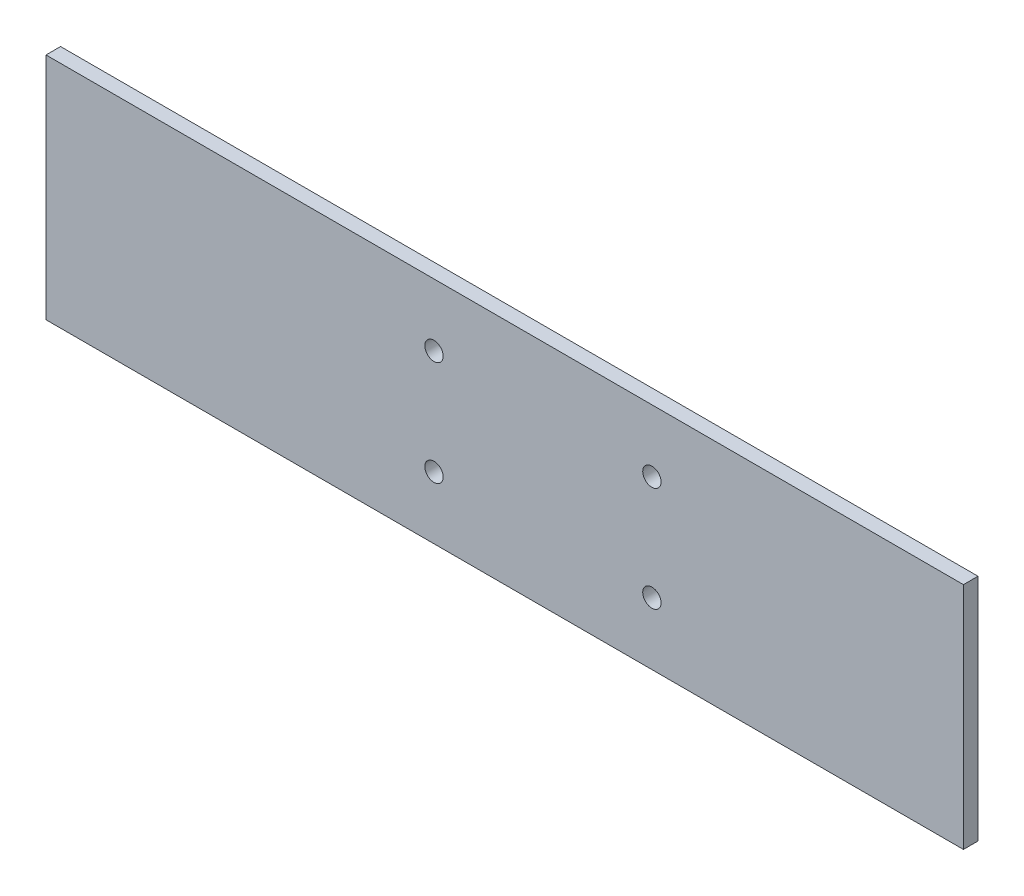
ISO-10303-21;
HEADER;
FILE_DESCRIPTION(('STEP AP214'),'2;1');
FILE_NAME('part.step','',(''),(''),'','','');
FILE_SCHEMA(('AUTOMOTIVE_DESIGN { 1 0 10303 214 1 1 1 1 }'));
ENDSEC;
DATA;
#1=APPLICATION_CONTEXT('core data for automotive mechanical design processes');
#2=APPLICATION_PROTOCOL_DEFINITION('international standard','automotive_design',2000,#1);
#3=PRODUCT_CONTEXT('',#1,'mechanical');
#4=PRODUCT('Part','Part','',(#3));
#5=PRODUCT_RELATED_PRODUCT_CATEGORY('part','',(#4));
#6=PRODUCT_DEFINITION_FORMATION('','',#4);
#7=PRODUCT_DEFINITION_CONTEXT('part definition',#1,'design');
#8=PRODUCT_DEFINITION('design','',#6,#7);
#9=PRODUCT_DEFINITION_SHAPE('','',#8);
#10=(LENGTH_UNIT() NAMED_UNIT(*) SI_UNIT(.MILLI.,.METRE.));
#11=(NAMED_UNIT(*) PLANE_ANGLE_UNIT() SI_UNIT($,.RADIAN.));
#12=(NAMED_UNIT(*) SI_UNIT($,.STERADIAN.) SOLID_ANGLE_UNIT());
#13=UNCERTAINTY_MEASURE_WITH_UNIT(LENGTH_MEASURE(1.E-05),#10,'distance_accuracy_value','');
#14=(GEOMETRIC_REPRESENTATION_CONTEXT(3) GLOBAL_UNCERTAINTY_ASSIGNED_CONTEXT((#13)) GLOBAL_UNIT_ASSIGNED_CONTEXT((#10,
#11,#12)) REPRESENTATION_CONTEXT('',''));
#15=CARTESIAN_POINT('',(0.,0.,0.));
#16=DIRECTION('',(0.,0.,1.));
#17=DIRECTION('',(1.,0.,0.));
#18=AXIS2_PLACEMENT_3D('',#15,#16,#17);
#19=CARTESIAN_POINT('',(0.,0.,9.525));
#20=DIRECTION('',(0.,0.,1.));
#21=DIRECTION('',(1.,0.,0.));
#22=AXIS2_PLACEMENT_3D('',#19,#20,#21);
#23=PLANE('',#22);
#24=CARTESIAN_POINT('',(196.25,-109.25,9.525));
#25=DIRECTION('',(0.,0.,1.));
#26=DIRECTION('',(1.,0.,0.));
#27=AXIS2_PLACEMENT_3D('',#24,#25,#26);
#28=CIRCLE('',#27,6.00000000000002);
#29=CARTESIAN_POINT('',(190.25,-109.25,9.525));
#30=VERTEX_POINT('',#29);
#31=EDGE_CURVE('E111',#30,#30,#28,.T.);
#32=ORIENTED_EDGE('',*,*,#31,.F.);
#33=EDGE_LOOP('',(#32));
#34=FACE_BOUND('',#33,.T.);
#35=CARTESIAN_POINT('',(53.75,-40.75,9.525));
#36=DIRECTION('',(0.,0.,1.));
#37=DIRECTION('',(1.,0.,0.));
#38=AXIS2_PLACEMENT_3D('',#35,#36,#37);
#39=CIRCLE('',#38,6.00000000000001);
#40=CARTESIAN_POINT('',(47.75,-40.75,9.525));
#41=VERTEX_POINT('',#40);
#42=EDGE_CURVE('E123',#41,#41,#39,.T.);
#43=ORIENTED_EDGE('',*,*,#42,.F.);
#44=EDGE_LOOP('',(#43));
#45=FACE_BOUND('',#44,.T.);
#46=DIRECTION('',(-1.,0.,0.));
#47=VECTOR('',#46,1.);
#48=CARTESIAN_POINT('',(0.,0.,9.525));
#49=LINE('',#48,#47);
#50=CARTESIAN_POINT('',(400.,0.,9.525));
#51=VERTEX_POINT('',#50);
#52=CARTESIAN_POINT('',(-200.,0.,9.525));
#53=VERTEX_POINT('',#52);
#54=EDGE_CURVE('E11',#51,#53,#49,.T.);
#55=ORIENTED_EDGE('',*,*,#54,.T.);
#56=DIRECTION('',(0.,1.,0.));
#57=VECTOR('',#56,1.);
#58=CARTESIAN_POINT('',(-200.,0.,9.525));
#59=LINE('',#58,#57);
#60=CARTESIAN_POINT('',(-200.,-150.,9.525));
#61=VERTEX_POINT('',#60);
#62=EDGE_CURVE('E76',#61,#53,#59,.T.);
#63=ORIENTED_EDGE('',*,*,#62,.F.);
#64=DIRECTION('',(1.,0.,0.));
#65=VECTOR('',#64,1.);
#66=CARTESIAN_POINT('',(0.,-150.,9.525));
#67=LINE('',#66,#65);
#68=CARTESIAN_POINT('',(400.,-150.,9.525));
#69=VERTEX_POINT('',#68);
#70=EDGE_CURVE('E42',#61,#69,#67,.T.);
#71=ORIENTED_EDGE('',*,*,#70,.T.);
#72=DIRECTION('',(0.,-1.,0.));
#73=VECTOR('',#72,1.);
#74=CARTESIAN_POINT('',(400.,0.,9.525));
#75=LINE('',#74,#73);
#76=EDGE_CURVE('E75',#51,#69,#75,.T.);
#77=ORIENTED_EDGE('',*,*,#76,.F.);
#78=EDGE_LOOP('',(#55,#63,#71,#77));
#79=FACE_BOUND('',#78,.T.);
#80=CARTESIAN_POINT('',(196.25,-40.75,9.525));
#81=DIRECTION('',(0.,0.,1.));
#82=DIRECTION('',(1.,0.,0.));
#83=AXIS2_PLACEMENT_3D('',#80,#81,#82);
#84=CIRCLE('',#83,6.00000000000002);
#85=CARTESIAN_POINT('',(190.25,-40.75,9.525));
#86=VERTEX_POINT('',#85);
#87=EDGE_CURVE('E117',#86,#86,#84,.T.);
#88=ORIENTED_EDGE('',*,*,#87,.F.);
#89=EDGE_LOOP('',(#88));
#90=FACE_BOUND('',#89,.T.);
#91=CARTESIAN_POINT('',(53.75,-109.25,9.525));
#92=DIRECTION('',(0.,0.,1.));
#93=DIRECTION('',(1.,0.,0.));
#94=AXIS2_PLACEMENT_3D('',#91,#92,#93);
#95=CIRCLE('',#94,6.00000000000001);
#96=CARTESIAN_POINT('',(47.75,-109.25,9.525));
#97=VERTEX_POINT('',#96);
#98=EDGE_CURVE('E105',#97,#97,#95,.T.);
#99=ORIENTED_EDGE('',*,*,#98,.F.);
#100=EDGE_LOOP('',(#99));
#101=FACE_BOUND('',#100,.T.);
#102=ADVANCED_FACE('F33',(#34,#45,#79,#90,#101),#23,.T.);
#103=CARTESIAN_POINT('',(0.,0.,0.));
#104=DIRECTION('',(0.,0.,1.));
#105=DIRECTION('',(1.,0.,0.));
#106=AXIS2_PLACEMENT_3D('',#103,#104,#105);
#107=PLANE('',#106);
#108=DIRECTION('',(1.,0.,0.));
#109=VECTOR('',#108,1.);
#110=CARTESIAN_POINT('',(0.,-150.,0.));
#111=LINE('',#110,#109);
#112=CARTESIAN_POINT('',(-200.,-150.,0.));
#113=VERTEX_POINT('',#112);
#114=CARTESIAN_POINT('',(400.,-150.,0.));
#115=VERTEX_POINT('',#114);
#116=EDGE_CURVE('E83',#113,#115,#111,.T.);
#117=ORIENTED_EDGE('',*,*,#116,.F.);
#118=DIRECTION('',(0.,-1.,0.));
#119=VECTOR('',#118,1.);
#120=CARTESIAN_POINT('',(-200.,0.,0.));
#121=LINE('',#120,#119);
#122=CARTESIAN_POINT('',(-200.,0.,0.));
#123=VERTEX_POINT('',#122);
#124=EDGE_CURVE('E96',#123,#113,#121,.T.);
#125=ORIENTED_EDGE('',*,*,#124,.F.);
#126=DIRECTION('',(-1.,0.,0.));
#127=VECTOR('',#126,1.);
#128=CARTESIAN_POINT('',(0.,0.,0.));
#129=LINE('',#128,#127);
#130=CARTESIAN_POINT('',(400.,0.,0.));
#131=VERTEX_POINT('',#130);
#132=EDGE_CURVE('E37',#131,#123,#129,.T.);
#133=ORIENTED_EDGE('',*,*,#132,.F.);
#134=DIRECTION('',(0.,1.,0.));
#135=VECTOR('',#134,1.);
#136=CARTESIAN_POINT('',(400.,0.,0.));
#137=LINE('',#136,#135);
#138=EDGE_CURVE('E87',#115,#131,#137,.T.);
#139=ORIENTED_EDGE('',*,*,#138,.F.);
#140=EDGE_LOOP('',(#117,#125,#133,#139));
#141=FACE_BOUND('',#140,.T.);
#142=CARTESIAN_POINT('',(53.75,-40.75,0.));
#143=DIRECTION('',(0.,0.,1.));
#144=DIRECTION('',(1.,0.,0.));
#145=AXIS2_PLACEMENT_3D('',#142,#143,#144);
#146=CIRCLE('',#145,6.00000000000001);
#147=CARTESIAN_POINT('',(47.75,-40.75,0.));
#148=VERTEX_POINT('',#147);
#149=EDGE_CURVE('E120',#148,#148,#146,.T.);
#150=ORIENTED_EDGE('',*,*,#149,.T.);
#151=EDGE_LOOP('',(#150));
#152=FACE_BOUND('',#151,.T.);
#153=CARTESIAN_POINT('',(196.25,-40.75,0.));
#154=DIRECTION('',(0.,0.,1.));
#155=DIRECTION('',(1.,0.,0.));
#156=AXIS2_PLACEMENT_3D('',#153,#154,#155);
#157=CIRCLE('',#156,6.00000000000002);
#158=CARTESIAN_POINT('',(190.25,-40.75,0.));
#159=VERTEX_POINT('',#158);
#160=EDGE_CURVE('E114',#159,#159,#157,.T.);
#161=ORIENTED_EDGE('',*,*,#160,.T.);
#162=EDGE_LOOP('',(#161));
#163=FACE_BOUND('',#162,.T.);
#164=CARTESIAN_POINT('',(196.25,-109.25,0.));
#165=DIRECTION('',(0.,0.,1.));
#166=DIRECTION('',(1.,0.,0.));
#167=AXIS2_PLACEMENT_3D('',#164,#165,#166);
#168=CIRCLE('',#167,6.00000000000002);
#169=CARTESIAN_POINT('',(190.25,-109.25,0.));
#170=VERTEX_POINT('',#169);
#171=EDGE_CURVE('E108',#170,#170,#168,.T.);
#172=ORIENTED_EDGE('',*,*,#171,.T.);
#173=EDGE_LOOP('',(#172));
#174=FACE_BOUND('',#173,.T.);
#175=CARTESIAN_POINT('',(53.75,-109.25,0.));
#176=DIRECTION('',(0.,0.,1.));
#177=DIRECTION('',(1.,0.,0.));
#178=AXIS2_PLACEMENT_3D('',#175,#176,#177);
#179=CIRCLE('',#178,6.00000000000001);
#180=CARTESIAN_POINT('',(47.75,-109.25,0.));
#181=VERTEX_POINT('',#180);
#182=EDGE_CURVE('E104',#181,#181,#179,.T.);
#183=ORIENTED_EDGE('',*,*,#182,.T.);
#184=EDGE_LOOP('',(#183));
#185=FACE_BOUND('',#184,.T.);
#186=ADVANCED_FACE('F129',(#141,#152,#163,#174,#185),#107,.F.);
#187=CARTESIAN_POINT('',(0.,-150.,9.525));
#188=DIRECTION('',(0.,1.,0.));
#189=DIRECTION('',(0.,0.,1.));
#190=AXIS2_PLACEMENT_3D('',#187,#188,#189);
#191=PLANE('',#190);
#192=ORIENTED_EDGE('',*,*,#116,.T.);
#193=DIRECTION('',(0.,0.,-1.));
#194=VECTOR('',#193,1.);
#195=CARTESIAN_POINT('',(400.,-150.,9.525));
#196=LINE('',#195,#194);
#197=EDGE_CURVE('E82',#69,#115,#196,.T.);
#198=ORIENTED_EDGE('',*,*,#197,.F.);
#199=ORIENTED_EDGE('',*,*,#70,.F.);
#200=DIRECTION('',(0.,0.,1.));
#201=VECTOR('',#200,1.);
#202=CARTESIAN_POINT('',(-200.,-150.,0.));
#203=LINE('',#202,#201);
#204=EDGE_CURVE('E99',#113,#61,#203,.T.);
#205=ORIENTED_EDGE('',*,*,#204,.F.);
#206=EDGE_LOOP('',(#192,#198,#199,#205));
#207=FACE_BOUND('',#206,.T.);
#208=ADVANCED_FACE('F35',(#207),#191,.F.);
#209=CARTESIAN_POINT('',(0.,0.,9.525));
#210=DIRECTION('',(0.,-1.,0.));
#211=DIRECTION('',(0.,0.,-1.));
#212=AXIS2_PLACEMENT_3D('',#209,#210,#211);
#213=PLANE('',#212);
#214=ORIENTED_EDGE('',*,*,#132,.T.);
#215=DIRECTION('',(0.,0.,-1.));
#216=VECTOR('',#215,1.);
#217=CARTESIAN_POINT('',(-200.,0.,0.));
#218=LINE('',#217,#216);
#219=EDGE_CURVE('E102',#53,#123,#218,.T.);
#220=ORIENTED_EDGE('',*,*,#219,.F.);
#221=ORIENTED_EDGE('',*,*,#54,.F.);
#222=DIRECTION('',(0.,0.,1.));
#223=VECTOR('',#222,1.);
#224=CARTESIAN_POINT('',(400.,0.,9.525));
#225=LINE('',#224,#223);
#226=EDGE_CURVE('E91',#131,#51,#225,.T.);
#227=ORIENTED_EDGE('',*,*,#226,.F.);
#228=EDGE_LOOP('',(#214,#220,#221,#227));
#229=FACE_BOUND('',#228,.T.);
#230=ADVANCED_FACE('F135',(#229),#213,.F.);
#231=CARTESIAN_POINT('',(53.75,-40.75,9.525));
#232=DIRECTION('',(0.,0.,-1.));
#233=DIRECTION('',(-1.,0.,0.));
#234=AXIS2_PLACEMENT_3D('',#231,#232,#233);
#235=CYLINDRICAL_SURFACE('',#234,6.00000000000001);
#236=CARTESIAN_POINT('',(47.75,-40.75,9.525));
#237=CARTESIAN_POINT('',(47.75,-40.75,9.42578125));
#238=CARTESIAN_POINT('',(47.75,-40.75,9.3265625));
#239=CARTESIAN_POINT('',(47.75,-40.75,9.128125));
#240=CARTESIAN_POINT('',(47.75,-40.75,9.02890625));
#241=CARTESIAN_POINT('',(47.75,-40.75,8.83046875));
#242=CARTESIAN_POINT('',(47.75,-40.75,8.73125));
#243=CARTESIAN_POINT('',(47.75,-40.75,8.5328125));
#244=CARTESIAN_POINT('',(47.75,-40.75,8.43359375));
#245=CARTESIAN_POINT('',(47.75,-40.75,8.23515625));
#246=CARTESIAN_POINT('',(47.75,-40.75,8.1359375));
#247=CARTESIAN_POINT('',(47.75,-40.75,7.9375));
#248=CARTESIAN_POINT('',(47.75,-40.75,7.83828125));
#249=CARTESIAN_POINT('',(47.75,-40.75,7.63984375));
#250=CARTESIAN_POINT('',(47.75,-40.75,7.540625));
#251=CARTESIAN_POINT('',(47.75,-40.75,7.3421875));
#252=CARTESIAN_POINT('',(47.75,-40.75,7.24296875));
#253=CARTESIAN_POINT('',(47.75,-40.75,7.04453125));
#254=CARTESIAN_POINT('',(47.75,-40.75,6.9453125));
#255=CARTESIAN_POINT('',(47.75,-40.75,6.746875));
#256=CARTESIAN_POINT('',(47.75,-40.75,6.64765625));
#257=CARTESIAN_POINT('',(47.75,-40.75,6.44921875));
#258=CARTESIAN_POINT('',(47.75,-40.75,6.35));
#259=CARTESIAN_POINT('',(47.75,-40.75,6.1515625));
#260=CARTESIAN_POINT('',(47.75,-40.75,6.05234375));
#261=CARTESIAN_POINT('',(47.75,-40.75,5.85390625));
#262=CARTESIAN_POINT('',(47.75,-40.75,5.7546875));
#263=CARTESIAN_POINT('',(47.75,-40.75,5.55625));
#264=CARTESIAN_POINT('',(47.75,-40.75,5.45703125));
#265=CARTESIAN_POINT('',(47.75,-40.75,5.25859375));
#266=CARTESIAN_POINT('',(47.75,-40.75,5.159375));
#267=CARTESIAN_POINT('',(47.75,-40.75,4.9609375));
#268=CARTESIAN_POINT('',(47.75,-40.75,4.86171875));
#269=CARTESIAN_POINT('',(47.75,-40.75,4.66328125));
#270=CARTESIAN_POINT('',(47.75,-40.75,4.5640625));
#271=CARTESIAN_POINT('',(47.75,-40.75,4.365625));
#272=CARTESIAN_POINT('',(47.75,-40.75,4.26640625));
#273=CARTESIAN_POINT('',(47.75,-40.75,4.06796875));
#274=CARTESIAN_POINT('',(47.75,-40.75,3.96875));
#275=CARTESIAN_POINT('',(47.75,-40.75,3.7703125));
#276=CARTESIAN_POINT('',(47.75,-40.75,3.67109375));
#277=CARTESIAN_POINT('',(47.75,-40.75,3.47265625));
#278=CARTESIAN_POINT('',(47.75,-40.75,3.3734375));
#279=CARTESIAN_POINT('',(47.75,-40.75,3.175));
#280=CARTESIAN_POINT('',(47.75,-40.75,3.07578125));
#281=CARTESIAN_POINT('',(47.75,-40.75,2.87734375));
#282=CARTESIAN_POINT('',(47.75,-40.75,2.778125));
#283=CARTESIAN_POINT('',(47.75,-40.75,2.5796875));
#284=CARTESIAN_POINT('',(47.75,-40.75,2.48046875));
#285=CARTESIAN_POINT('',(47.75,-40.75,2.28203125));
#286=CARTESIAN_POINT('',(47.75,-40.75,2.1828125));
#287=CARTESIAN_POINT('',(47.75,-40.75,1.984375));
#288=CARTESIAN_POINT('',(47.75,-40.75,1.88515625));
#289=CARTESIAN_POINT('',(47.75,-40.75,1.68671875));
#290=CARTESIAN_POINT('',(47.75,-40.75,1.5875));
#291=CARTESIAN_POINT('',(47.75,-40.75,1.3890625));
#292=CARTESIAN_POINT('',(47.75,-40.75,1.28984375));
#293=CARTESIAN_POINT('',(47.75,-40.75,1.09140625));
#294=CARTESIAN_POINT('',(47.75,-40.75,0.992187500000001));
#295=CARTESIAN_POINT('',(47.75,-40.75,0.793750000000001));
#296=CARTESIAN_POINT('',(47.75,-40.75,0.69453125));
#297=CARTESIAN_POINT('',(47.75,-40.75,0.49609375));
#298=CARTESIAN_POINT('',(47.75,-40.75,0.396875));
#299=CARTESIAN_POINT('',(47.75,-40.75,0.1984375));
#300=CARTESIAN_POINT('',(47.75,-40.75,0.0992187500000001));
#301=CARTESIAN_POINT('',(47.75,-40.75,0.));
#302=B_SPLINE_CURVE_WITH_KNOTS('',3,(#236,#237,#238,#239,#240,#241,#242,#243,#244,#245,#246,
#247,#248,#249,#250,#251,#252,#253,#254,#255,#256,#257,#258,#259,#260,#261,#262,#263,#264,#265,
#266,#267,#268,#269,#270,#271,#272,#273,#274,#275,#276,#277,#278,#279,#280,#281,#282,#283,#284,
#285,#286,#287,#288,#289,#290,#291,#292,#293,#294,#295,#296,#297,#298,#299,#300,#301),
.UNSPECIFIED.,.F.,.F.,(4,2,2,2,2,2,2,2,2,2,2,2,2,2,2,2,2,2,2,2,2,2,2,2,2,2,2,2,2,2,2,2,4),(0.,
0.29765625,0.5953125,0.892968750000001,1.190625,1.48828125,1.7859375,2.08359375,2.38125,
2.67890625,2.9765625,3.27421875,3.571875,3.86953125,4.1671875,4.46484375,4.7625,5.06015625,
5.3578125,5.65546875,5.953125,6.25078125,6.5484375,6.84609375,7.14375,7.44140625,7.7390625,
8.03671875,8.334375,8.63203125,8.9296875,9.22734375,9.525),.UNSPECIFIED.);
#303=EDGE_CURVE('BSEAM132',#41,#148,#302,.T.);
#304=ORIENTED_EDGE('',*,*,#42,.T.);
#305=ORIENTED_EDGE('',*,*,#149,.F.);
#306=ORIENTED_EDGE('',*,*,#303,.T.);
#307=ORIENTED_EDGE('',*,*,#303,.F.);
#308=EDGE_LOOP('',(#304,#306,#305,#307));
#309=FACE_BOUND('',#308,.T.);
#310=ADVANCED_FACE('F132',(#309),#235,.F.);
#311=CARTESIAN_POINT('',(196.25,-40.75,9.525));
#312=DIRECTION('',(0.,0.,-1.));
#313=DIRECTION('',(-1.,0.,0.));
#314=AXIS2_PLACEMENT_3D('',#311,#312,#313);
#315=CYLINDRICAL_SURFACE('',#314,6.00000000000002);
#316=CARTESIAN_POINT('',(190.25,-40.75,9.525));
#317=CARTESIAN_POINT('',(190.25,-40.75,9.42578125));
#318=CARTESIAN_POINT('',(190.25,-40.75,9.3265625));
#319=CARTESIAN_POINT('',(190.25,-40.75,9.128125));
#320=CARTESIAN_POINT('',(190.25,-40.75,9.02890625));
#321=CARTESIAN_POINT('',(190.25,-40.75,8.83046875));
#322=CARTESIAN_POINT('',(190.25,-40.75,8.73125));
#323=CARTESIAN_POINT('',(190.25,-40.75,8.5328125));
#324=CARTESIAN_POINT('',(190.25,-40.75,8.43359375));
#325=CARTESIAN_POINT('',(190.25,-40.75,8.23515625));
#326=CARTESIAN_POINT('',(190.25,-40.75,8.1359375));
#327=CARTESIAN_POINT('',(190.25,-40.75,7.9375));
#328=CARTESIAN_POINT('',(190.25,-40.75,7.83828125));
#329=CARTESIAN_POINT('',(190.25,-40.75,7.63984375));
#330=CARTESIAN_POINT('',(190.25,-40.75,7.540625));
#331=CARTESIAN_POINT('',(190.25,-40.75,7.3421875));
#332=CARTESIAN_POINT('',(190.25,-40.75,7.24296875));
#333=CARTESIAN_POINT('',(190.25,-40.75,7.04453125));
#334=CARTESIAN_POINT('',(190.25,-40.75,6.9453125));
#335=CARTESIAN_POINT('',(190.25,-40.75,6.746875));
#336=CARTESIAN_POINT('',(190.25,-40.75,6.64765625));
#337=CARTESIAN_POINT('',(190.25,-40.75,6.44921875));
#338=CARTESIAN_POINT('',(190.25,-40.75,6.35));
#339=CARTESIAN_POINT('',(190.25,-40.75,6.1515625));
#340=CARTESIAN_POINT('',(190.25,-40.75,6.05234375));
#341=CARTESIAN_POINT('',(190.25,-40.75,5.85390625));
#342=CARTESIAN_POINT('',(190.25,-40.75,5.7546875));
#343=CARTESIAN_POINT('',(190.25,-40.75,5.55625));
#344=CARTESIAN_POINT('',(190.25,-40.75,5.45703125));
#345=CARTESIAN_POINT('',(190.25,-40.75,5.25859375));
#346=CARTESIAN_POINT('',(190.25,-40.75,5.159375));
#347=CARTESIAN_POINT('',(190.25,-40.75,4.9609375));
#348=CARTESIAN_POINT('',(190.25,-40.75,4.86171875));
#349=CARTESIAN_POINT('',(190.25,-40.75,4.66328125));
#350=CARTESIAN_POINT('',(190.25,-40.75,4.5640625));
#351=CARTESIAN_POINT('',(190.25,-40.75,4.365625));
#352=CARTESIAN_POINT('',(190.25,-40.75,4.26640625));
#353=CARTESIAN_POINT('',(190.25,-40.75,4.06796875));
#354=CARTESIAN_POINT('',(190.25,-40.75,3.96875));
#355=CARTESIAN_POINT('',(190.25,-40.75,3.7703125));
#356=CARTESIAN_POINT('',(190.25,-40.75,3.67109375));
#357=CARTESIAN_POINT('',(190.25,-40.75,3.47265625));
#358=CARTESIAN_POINT('',(190.25,-40.75,3.3734375));
#359=CARTESIAN_POINT('',(190.25,-40.75,3.175));
#360=CARTESIAN_POINT('',(190.25,-40.75,3.07578125));
#361=CARTESIAN_POINT('',(190.25,-40.75,2.87734375));
#362=CARTESIAN_POINT('',(190.25,-40.75,2.778125));
#363=CARTESIAN_POINT('',(190.25,-40.75,2.5796875));
#364=CARTESIAN_POINT('',(190.25,-40.75,2.48046875));
#365=CARTESIAN_POINT('',(190.25,-40.75,2.28203125));
#366=CARTESIAN_POINT('',(190.25,-40.75,2.1828125));
#367=CARTESIAN_POINT('',(190.25,-40.75,1.984375));
#368=CARTESIAN_POINT('',(190.25,-40.75,1.88515625));
#369=CARTESIAN_POINT('',(190.25,-40.75,1.68671875));
#370=CARTESIAN_POINT('',(190.25,-40.75,1.5875));
#371=CARTESIAN_POINT('',(190.25,-40.75,1.3890625));
#372=CARTESIAN_POINT('',(190.25,-40.75,1.28984375));
#373=CARTESIAN_POINT('',(190.25,-40.75,1.09140625));
#374=CARTESIAN_POINT('',(190.25,-40.75,0.992187500000001));
#375=CARTESIAN_POINT('',(190.25,-40.75,0.793750000000001));
#376=CARTESIAN_POINT('',(190.25,-40.75,0.69453125));
#377=CARTESIAN_POINT('',(190.25,-40.75,0.49609375));
#378=CARTESIAN_POINT('',(190.25,-40.75,0.396875));
#379=CARTESIAN_POINT('',(190.25,-40.75,0.1984375));
#380=CARTESIAN_POINT('',(190.25,-40.75,0.0992187500000001));
#381=CARTESIAN_POINT('',(190.25,-40.75,0.));
#382=B_SPLINE_CURVE_WITH_KNOTS('',3,(#316,#317,#318,#319,#320,#321,#322,#323,#324,#325,#326,
#327,#328,#329,#330,#331,#332,#333,#334,#335,#336,#337,#338,#339,#340,#341,#342,#343,#344,#345,
#346,#347,#348,#349,#350,#351,#352,#353,#354,#355,#356,#357,#358,#359,#360,#361,#362,#363,#364,
#365,#366,#367,#368,#369,#370,#371,#372,#373,#374,#375,#376,#377,#378,#379,#380,#381),
.UNSPECIFIED.,.F.,.F.,(4,2,2,2,2,2,2,2,2,2,2,2,2,2,2,2,2,2,2,2,2,2,2,2,2,2,2,2,2,2,2,2,4),(0.,
0.29765625,0.5953125,0.892968750000001,1.190625,1.48828125,1.7859375,2.08359375,2.38125,
2.67890625,2.9765625,3.27421875,3.571875,3.86953125,4.1671875,4.46484375,4.7625,5.06015625,
5.3578125,5.65546875,5.953125,6.25078125,6.5484375,6.84609375,7.14375,7.44140625,7.7390625,
8.03671875,8.334375,8.63203125,8.9296875,9.22734375,9.525),.UNSPECIFIED.);
#383=EDGE_CURVE('BSEAM134',#86,#159,#382,.T.);
#384=ORIENTED_EDGE('',*,*,#87,.T.);
#385=ORIENTED_EDGE('',*,*,#160,.F.);
#386=ORIENTED_EDGE('',*,*,#383,.T.);
#387=ORIENTED_EDGE('',*,*,#383,.F.);
#388=EDGE_LOOP('',(#384,#386,#385,#387));
#389=FACE_BOUND('',#388,.T.);
#390=ADVANCED_FACE('F134',(#389),#315,.F.);
#391=CARTESIAN_POINT('',(196.25,-109.25,9.525));
#392=DIRECTION('',(0.,0.,-1.));
#393=DIRECTION('',(-1.,0.,0.));
#394=AXIS2_PLACEMENT_3D('',#391,#392,#393);
#395=CYLINDRICAL_SURFACE('',#394,6.00000000000002);
#396=CARTESIAN_POINT('',(190.25,-109.25,9.525));
#397=CARTESIAN_POINT('',(190.25,-109.25,9.42578125));
#398=CARTESIAN_POINT('',(190.25,-109.25,9.3265625));
#399=CARTESIAN_POINT('',(190.25,-109.25,9.128125));
#400=CARTESIAN_POINT('',(190.25,-109.25,9.02890625));
#401=CARTESIAN_POINT('',(190.25,-109.25,8.83046875));
#402=CARTESIAN_POINT('',(190.25,-109.25,8.73125));
#403=CARTESIAN_POINT('',(190.25,-109.25,8.5328125));
#404=CARTESIAN_POINT('',(190.25,-109.25,8.43359375));
#405=CARTESIAN_POINT('',(190.25,-109.25,8.23515625));
#406=CARTESIAN_POINT('',(190.25,-109.25,8.1359375));
#407=CARTESIAN_POINT('',(190.25,-109.25,7.9375));
#408=CARTESIAN_POINT('',(190.25,-109.25,7.83828125));
#409=CARTESIAN_POINT('',(190.25,-109.25,7.63984375));
#410=CARTESIAN_POINT('',(190.25,-109.25,7.540625));
#411=CARTESIAN_POINT('',(190.25,-109.25,7.3421875));
#412=CARTESIAN_POINT('',(190.25,-109.25,7.24296875));
#413=CARTESIAN_POINT('',(190.25,-109.25,7.04453125));
#414=CARTESIAN_POINT('',(190.25,-109.25,6.9453125));
#415=CARTESIAN_POINT('',(190.25,-109.25,6.746875));
#416=CARTESIAN_POINT('',(190.25,-109.25,6.64765625));
#417=CARTESIAN_POINT('',(190.25,-109.25,6.44921875));
#418=CARTESIAN_POINT('',(190.25,-109.25,6.35));
#419=CARTESIAN_POINT('',(190.25,-109.25,6.1515625));
#420=CARTESIAN_POINT('',(190.25,-109.25,6.05234375));
#421=CARTESIAN_POINT('',(190.25,-109.25,5.85390625));
#422=CARTESIAN_POINT('',(190.25,-109.25,5.7546875));
#423=CARTESIAN_POINT('',(190.25,-109.25,5.55625));
#424=CARTESIAN_POINT('',(190.25,-109.25,5.45703125));
#425=CARTESIAN_POINT('',(190.25,-109.25,5.25859375));
#426=CARTESIAN_POINT('',(190.25,-109.25,5.159375));
#427=CARTESIAN_POINT('',(190.25,-109.25,4.9609375));
#428=CARTESIAN_POINT('',(190.25,-109.25,4.86171875));
#429=CARTESIAN_POINT('',(190.25,-109.25,4.66328125));
#430=CARTESIAN_POINT('',(190.25,-109.25,4.5640625));
#431=CARTESIAN_POINT('',(190.25,-109.25,4.365625));
#432=CARTESIAN_POINT('',(190.25,-109.25,4.26640625));
#433=CARTESIAN_POINT('',(190.25,-109.25,4.06796875));
#434=CARTESIAN_POINT('',(190.25,-109.25,3.96875));
#435=CARTESIAN_POINT('',(190.25,-109.25,3.7703125));
#436=CARTESIAN_POINT('',(190.25,-109.25,3.67109375));
#437=CARTESIAN_POINT('',(190.25,-109.25,3.47265625));
#438=CARTESIAN_POINT('',(190.25,-109.25,3.3734375));
#439=CARTESIAN_POINT('',(190.25,-109.25,3.175));
#440=CARTESIAN_POINT('',(190.25,-109.25,3.07578125));
#441=CARTESIAN_POINT('',(190.25,-109.25,2.87734375));
#442=CARTESIAN_POINT('',(190.25,-109.25,2.778125));
#443=CARTESIAN_POINT('',(190.25,-109.25,2.5796875));
#444=CARTESIAN_POINT('',(190.25,-109.25,2.48046875));
#445=CARTESIAN_POINT('',(190.25,-109.25,2.28203125));
#446=CARTESIAN_POINT('',(190.25,-109.25,2.1828125));
#447=CARTESIAN_POINT('',(190.25,-109.25,1.984375));
#448=CARTESIAN_POINT('',(190.25,-109.25,1.88515625));
#449=CARTESIAN_POINT('',(190.25,-109.25,1.68671875));
#450=CARTESIAN_POINT('',(190.25,-109.25,1.5875));
#451=CARTESIAN_POINT('',(190.25,-109.25,1.3890625));
#452=CARTESIAN_POINT('',(190.25,-109.25,1.28984375));
#453=CARTESIAN_POINT('',(190.25,-109.25,1.09140625));
#454=CARTESIAN_POINT('',(190.25,-109.25,0.992187500000001));
#455=CARTESIAN_POINT('',(190.25,-109.25,0.793750000000001));
#456=CARTESIAN_POINT('',(190.25,-109.25,0.69453125));
#457=CARTESIAN_POINT('',(190.25,-109.25,0.49609375));
#458=CARTESIAN_POINT('',(190.25,-109.25,0.396875));
#459=CARTESIAN_POINT('',(190.25,-109.25,0.1984375));
#460=CARTESIAN_POINT('',(190.25,-109.25,0.0992187500000001));
#461=CARTESIAN_POINT('',(190.25,-109.25,0.));
#462=B_SPLINE_CURVE_WITH_KNOTS('',3,(#396,#397,#398,#399,#400,#401,#402,#403,#404,#405,#406,
#407,#408,#409,#410,#411,#412,#413,#414,#415,#416,#417,#418,#419,#420,#421,#422,#423,#424,#425,
#426,#427,#428,#429,#430,#431,#432,#433,#434,#435,#436,#437,#438,#439,#440,#441,#442,#443,#444,
#445,#446,#447,#448,#449,#450,#451,#452,#453,#454,#455,#456,#457,#458,#459,#460,#461),
.UNSPECIFIED.,.F.,.F.,(4,2,2,2,2,2,2,2,2,2,2,2,2,2,2,2,2,2,2,2,2,2,2,2,2,2,2,2,2,2,2,2,4),(0.,
0.29765625,0.5953125,0.892968750000001,1.190625,1.48828125,1.7859375,2.08359375,2.38125,
2.67890625,2.9765625,3.27421875,3.571875,3.86953125,4.1671875,4.46484375,4.7625,5.06015625,
5.3578125,5.65546875,5.953125,6.25078125,6.5484375,6.84609375,7.14375,7.44140625,7.7390625,
8.03671875,8.334375,8.63203125,8.9296875,9.22734375,9.525),.UNSPECIFIED.);
#463=EDGE_CURVE('BSEAM141',#30,#170,#462,.T.);
#464=ORIENTED_EDGE('',*,*,#31,.T.);
#465=ORIENTED_EDGE('',*,*,#171,.F.);
#466=ORIENTED_EDGE('',*,*,#463,.T.);
#467=ORIENTED_EDGE('',*,*,#463,.F.);
#468=EDGE_LOOP('',(#464,#466,#465,#467));
#469=FACE_BOUND('',#468,.T.);
#470=ADVANCED_FACE('F141',(#469),#395,.F.);
#471=CARTESIAN_POINT('',(53.75,-109.25,9.525));
#472=DIRECTION('',(0.,0.,-1.));
#473=DIRECTION('',(-1.,0.,0.));
#474=AXIS2_PLACEMENT_3D('',#471,#472,#473);
#475=CYLINDRICAL_SURFACE('',#474,6.00000000000001);
#476=CARTESIAN_POINT('',(47.75,-109.25,9.525));
#477=CARTESIAN_POINT('',(47.75,-109.25,9.42578125));
#478=CARTESIAN_POINT('',(47.75,-109.25,9.3265625));
#479=CARTESIAN_POINT('',(47.75,-109.25,9.128125));
#480=CARTESIAN_POINT('',(47.75,-109.25,9.02890625));
#481=CARTESIAN_POINT('',(47.75,-109.25,8.83046875));
#482=CARTESIAN_POINT('',(47.75,-109.25,8.73125));
#483=CARTESIAN_POINT('',(47.75,-109.25,8.5328125));
#484=CARTESIAN_POINT('',(47.75,-109.25,8.43359375));
#485=CARTESIAN_POINT('',(47.75,-109.25,8.23515625));
#486=CARTESIAN_POINT('',(47.75,-109.25,8.1359375));
#487=CARTESIAN_POINT('',(47.75,-109.25,7.9375));
#488=CARTESIAN_POINT('',(47.75,-109.25,7.83828125));
#489=CARTESIAN_POINT('',(47.75,-109.25,7.63984375));
#490=CARTESIAN_POINT('',(47.75,-109.25,7.540625));
#491=CARTESIAN_POINT('',(47.75,-109.25,7.3421875));
#492=CARTESIAN_POINT('',(47.75,-109.25,7.24296875));
#493=CARTESIAN_POINT('',(47.75,-109.25,7.04453125));
#494=CARTESIAN_POINT('',(47.75,-109.25,6.9453125));
#495=CARTESIAN_POINT('',(47.75,-109.25,6.746875));
#496=CARTESIAN_POINT('',(47.75,-109.25,6.64765625));
#497=CARTESIAN_POINT('',(47.75,-109.25,6.44921875));
#498=CARTESIAN_POINT('',(47.75,-109.25,6.35));
#499=CARTESIAN_POINT('',(47.75,-109.25,6.1515625));
#500=CARTESIAN_POINT('',(47.75,-109.25,6.05234375));
#501=CARTESIAN_POINT('',(47.75,-109.25,5.85390625));
#502=CARTESIAN_POINT('',(47.75,-109.25,5.7546875));
#503=CARTESIAN_POINT('',(47.75,-109.25,5.55625));
#504=CARTESIAN_POINT('',(47.75,-109.25,5.45703125));
#505=CARTESIAN_POINT('',(47.75,-109.25,5.25859375));
#506=CARTESIAN_POINT('',(47.75,-109.25,5.159375));
#507=CARTESIAN_POINT('',(47.75,-109.25,4.9609375));
#508=CARTESIAN_POINT('',(47.75,-109.25,4.86171875));
#509=CARTESIAN_POINT('',(47.75,-109.25,4.66328125));
#510=CARTESIAN_POINT('',(47.75,-109.25,4.5640625));
#511=CARTESIAN_POINT('',(47.75,-109.25,4.365625));
#512=CARTESIAN_POINT('',(47.75,-109.25,4.26640625));
#513=CARTESIAN_POINT('',(47.75,-109.25,4.06796875));
#514=CARTESIAN_POINT('',(47.75,-109.25,3.96875));
#515=CARTESIAN_POINT('',(47.75,-109.25,3.7703125));
#516=CARTESIAN_POINT('',(47.75,-109.25,3.67109375));
#517=CARTESIAN_POINT('',(47.75,-109.25,3.47265625));
#518=CARTESIAN_POINT('',(47.75,-109.25,3.3734375));
#519=CARTESIAN_POINT('',(47.75,-109.25,3.175));
#520=CARTESIAN_POINT('',(47.75,-109.25,3.07578125));
#521=CARTESIAN_POINT('',(47.75,-109.25,2.87734375));
#522=CARTESIAN_POINT('',(47.75,-109.25,2.778125));
#523=CARTESIAN_POINT('',(47.75,-109.25,2.5796875));
#524=CARTESIAN_POINT('',(47.75,-109.25,2.48046875));
#525=CARTESIAN_POINT('',(47.75,-109.25,2.28203125));
#526=CARTESIAN_POINT('',(47.75,-109.25,2.1828125));
#527=CARTESIAN_POINT('',(47.75,-109.25,1.984375));
#528=CARTESIAN_POINT('',(47.75,-109.25,1.88515625));
#529=CARTESIAN_POINT('',(47.75,-109.25,1.68671875));
#530=CARTESIAN_POINT('',(47.75,-109.25,1.5875));
#531=CARTESIAN_POINT('',(47.75,-109.25,1.3890625));
#532=CARTESIAN_POINT('',(47.75,-109.25,1.28984375));
#533=CARTESIAN_POINT('',(47.75,-109.25,1.09140625));
#534=CARTESIAN_POINT('',(47.75,-109.25,0.992187500000001));
#535=CARTESIAN_POINT('',(47.75,-109.25,0.793750000000001));
#536=CARTESIAN_POINT('',(47.75,-109.25,0.69453125));
#537=CARTESIAN_POINT('',(47.75,-109.25,0.49609375));
#538=CARTESIAN_POINT('',(47.75,-109.25,0.396875));
#539=CARTESIAN_POINT('',(47.75,-109.25,0.1984375));
#540=CARTESIAN_POINT('',(47.75,-109.25,0.0992187500000001));
#541=CARTESIAN_POINT('',(47.75,-109.25,0.));
#542=B_SPLINE_CURVE_WITH_KNOTS('',3,(#476,#477,#478,#479,#480,#481,#482,#483,#484,#485,#486,
#487,#488,#489,#490,#491,#492,#493,#494,#495,#496,#497,#498,#499,#500,#501,#502,#503,#504,#505,
#506,#507,#508,#509,#510,#511,#512,#513,#514,#515,#516,#517,#518,#519,#520,#521,#522,#523,#524,
#525,#526,#527,#528,#529,#530,#531,#532,#533,#534,#535,#536,#537,#538,#539,#540,#541),
.UNSPECIFIED.,.F.,.F.,(4,2,2,2,2,2,2,2,2,2,2,2,2,2,2,2,2,2,2,2,2,2,2,2,2,2,2,2,2,2,2,2,4),(0.,
0.29765625,0.5953125,0.892968750000001,1.190625,1.48828125,1.7859375,2.08359375,2.38125,
2.67890625,2.9765625,3.27421875,3.571875,3.86953125,4.1671875,4.46484375,4.7625,5.06015625,
5.3578125,5.65546875,5.953125,6.25078125,6.5484375,6.84609375,7.14375,7.44140625,7.7390625,
8.03671875,8.334375,8.63203125,8.9296875,9.22734375,9.525),.UNSPECIFIED.);
#543=EDGE_CURVE('BSEAM160',#97,#181,#542,.T.);
#544=ORIENTED_EDGE('',*,*,#98,.T.);
#545=ORIENTED_EDGE('',*,*,#182,.F.);
#546=ORIENTED_EDGE('',*,*,#543,.T.);
#547=ORIENTED_EDGE('',*,*,#543,.F.);
#548=EDGE_LOOP('',(#544,#546,#545,#547));
#549=FACE_BOUND('',#548,.T.);
#550=ADVANCED_FACE('F160',(#549),#475,.F.);
#551=CARTESIAN_POINT('',(-200.,0.,0.));
#552=DIRECTION('',(-1.,0.,0.));
#553=DIRECTION('',(0.,-1.,0.));
#554=AXIS2_PLACEMENT_3D('',#551,#552,#553);
#555=PLANE('',#554);
#556=ORIENTED_EDGE('',*,*,#124,.T.);
#557=ORIENTED_EDGE('',*,*,#204,.T.);
#558=ORIENTED_EDGE('',*,*,#62,.T.);
#559=ORIENTED_EDGE('',*,*,#219,.T.);
#560=EDGE_LOOP('',(#556,#557,#558,#559));
#561=FACE_BOUND('',#560,.T.);
#562=ADVANCED_FACE('F167',(#561),#555,.T.);
#563=CARTESIAN_POINT('',(400.,0.,0.));
#564=DIRECTION('',(1.,0.,0.));
#565=DIRECTION('',(0.,1.,0.));
#566=AXIS2_PLACEMENT_3D('',#563,#564,#565);
#567=PLANE('',#566);
#568=ORIENTED_EDGE('',*,*,#76,.T.);
#569=ORIENTED_EDGE('',*,*,#197,.T.);
#570=ORIENTED_EDGE('',*,*,#138,.T.);
#571=ORIENTED_EDGE('',*,*,#226,.T.);
#572=EDGE_LOOP('',(#568,#569,#570,#571));
#573=FACE_BOUND('',#572,.T.);
#574=ADVANCED_FACE('F90',(#573),#567,.T.);
#575=CLOSED_SHELL('',(#102,#186,#208,#230,#310,#390,#470,#550,#562,#574));
#576=MANIFOLD_SOLID_BREP('B2',#575);
#577=ADVANCED_BREP_SHAPE_REPRESENTATION('',(#18,#576),#14);
#578=SHAPE_DEFINITION_REPRESENTATION(#9,#577);
ENDSEC;
END-ISO-10303-21;
